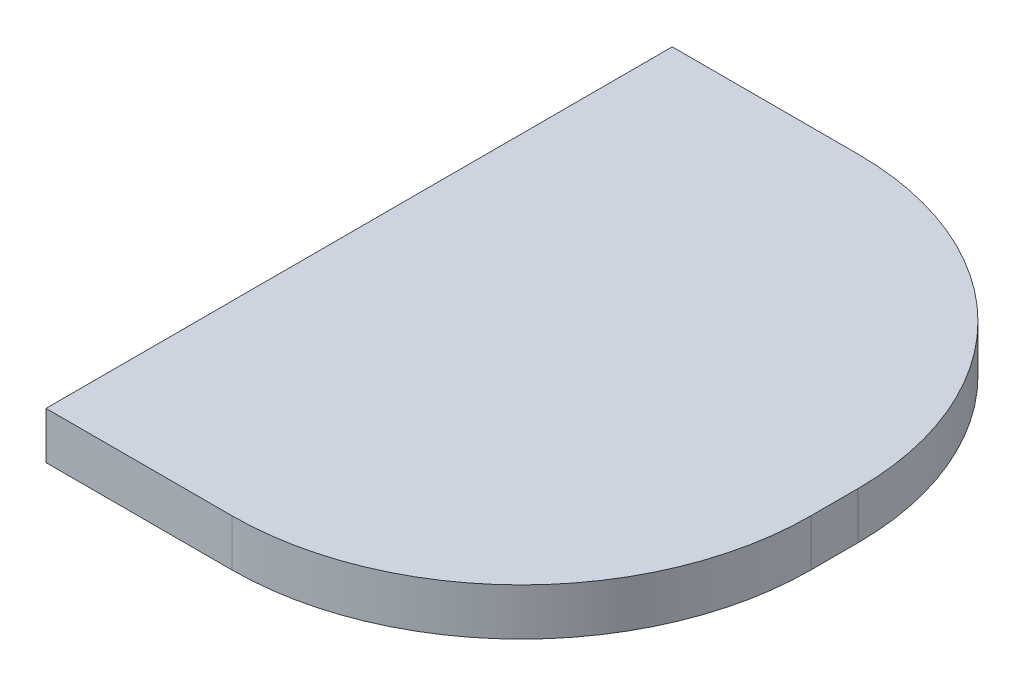
ISO-10303-21;
HEADER;
FILE_DESCRIPTION(('STEP AP214'),'2;1');
FILE_NAME('part.step','',(''),(''),'','','');
FILE_SCHEMA(('AUTOMOTIVE_DESIGN { 1 0 10303 214 1 1 1 1 }'));
ENDSEC;
DATA;
#1=APPLICATION_CONTEXT('core data for automotive mechanical design processes');
#2=APPLICATION_PROTOCOL_DEFINITION('international standard','automotive_design',2000,#1);
#3=PRODUCT_CONTEXT('',#1,'mechanical');
#4=PRODUCT('Part','Part','',(#3));
#5=PRODUCT_RELATED_PRODUCT_CATEGORY('part','',(#4));
#6=PRODUCT_DEFINITION_FORMATION('','',#4);
#7=PRODUCT_DEFINITION_CONTEXT('part definition',#1,'design');
#8=PRODUCT_DEFINITION('design','',#6,#7);
#9=PRODUCT_DEFINITION_SHAPE('','',#8);
#10=(LENGTH_UNIT() NAMED_UNIT(*) SI_UNIT(.MILLI.,.METRE.));
#11=(NAMED_UNIT(*) PLANE_ANGLE_UNIT() SI_UNIT($,.RADIAN.));
#12=(NAMED_UNIT(*) SI_UNIT($,.STERADIAN.) SOLID_ANGLE_UNIT());
#13=UNCERTAINTY_MEASURE_WITH_UNIT(LENGTH_MEASURE(1.E-05),#10,'distance_accuracy_value','');
#14=(GEOMETRIC_REPRESENTATION_CONTEXT(3) GLOBAL_UNCERTAINTY_ASSIGNED_CONTEXT((#13)) GLOBAL_UNIT_ASSIGNED_CONTEXT((#10,
#11,#12)) REPRESENTATION_CONTEXT('',''));
#15=CARTESIAN_POINT('',(0.,0.,0.));
#16=DIRECTION('',(0.,0.,1.));
#17=DIRECTION('',(1.,0.,0.));
#18=AXIS2_PLACEMENT_3D('',#15,#16,#17);
#19=CARTESIAN_POINT('',(15.1833043012193,-1.5,40.));
#20=DIRECTION('',(-1.,0.,0.));
#21=DIRECTION('',(0.,0.,1.));
#22=AXIS2_PLACEMENT_3D('',#19,#20,#21);
#23=PLANE('',#22);
#24=DIRECTION('',(0.,0.,-1.));
#25=VECTOR('',#24,1.);
#26=CARTESIAN_POINT('',(15.1833043012193,1.5,40.));
#27=LINE('',#26,#25);
#28=CARTESIAN_POINT('',(15.1833043012193,1.5,21.5));
#29=VERTEX_POINT('',#28);
#30=CARTESIAN_POINT('',(15.1833043012193,1.5,18.5));
#31=VERTEX_POINT('',#30);
#32=EDGE_CURVE('E110',#29,#31,#27,.T.);
#33=ORIENTED_EDGE('',*,*,#32,.F.);
#34=DIRECTION('',(0.,1.,0.));
#35=VECTOR('',#34,1.);
#36=CARTESIAN_POINT('',(15.1833043012193,-1.5,21.5));
#37=LINE('',#36,#35);
#38=CARTESIAN_POINT('',(15.1833043012193,-1.5,21.5));
#39=VERTEX_POINT('',#38);
#40=EDGE_CURVE('E137',#29,#39,#37,.F.);
#41=ORIENTED_EDGE('',*,*,#40,.T.);
#42=DIRECTION('',(0.,0.,-1.));
#43=VECTOR('',#42,1.);
#44=CARTESIAN_POINT('',(15.1833043012193,-1.5,40.));
#45=LINE('',#44,#43);
#46=CARTESIAN_POINT('',(15.1833043012193,-1.5,18.5));
#47=VERTEX_POINT('',#46);
#48=EDGE_CURVE('E118',#39,#47,#45,.T.);
#49=ORIENTED_EDGE('',*,*,#48,.T.);
#50=DIRECTION('',(0.,1.,0.));
#51=VECTOR('',#50,1.);
#52=CARTESIAN_POINT('',(15.1833043012193,1.5,18.5));
#53=LINE('',#52,#51);
#54=EDGE_CURVE('E134',#47,#31,#53,.T.);
#55=ORIENTED_EDGE('',*,*,#54,.T.);
#56=EDGE_LOOP('',(#33,#41,#49,#55));
#57=FACE_BOUND('',#56,.T.);
#58=ADVANCED_FACE('F38',(#57),#23,.F.);
#59=CARTESIAN_POINT('',(-15.1833043012193,1.5,40.));
#60=DIRECTION('',(0.,-1.,0.));
#61=DIRECTION('',(0.,0.,-1.));
#62=AXIS2_PLACEMENT_3D('',#59,#60,#61);
#63=PLANE('',#62);
#64=DIRECTION('',(-1.,0.,0.));
#65=VECTOR('',#64,1.);
#66=CARTESIAN_POINT('',(-15.1833043012193,1.5,40.));
#67=LINE('',#66,#65);
#68=CARTESIAN_POINT('',(-3.31669569878067,1.5,40.));
#69=VERTEX_POINT('',#68);
#70=CARTESIAN_POINT('',(-15.1833043012193,1.5,40.));
#71=VERTEX_POINT('',#70);
#72=EDGE_CURVE('E92',#69,#71,#67,.T.);
#73=ORIENTED_EDGE('',*,*,#72,.F.);
#74=CARTESIAN_POINT('',(-3.31669569878067,1.5,21.5));
#75=DIRECTION('',(0.,-1.,0.));
#76=DIRECTION('',(0.,0.,-1.));
#77=AXIS2_PLACEMENT_3D('',#74,#75,#76);
#78=CIRCLE('',#77,18.5);
#79=EDGE_CURVE('E132',#69,#29,#78,.F.);
#80=ORIENTED_EDGE('',*,*,#79,.T.);
#81=ORIENTED_EDGE('',*,*,#32,.T.);
#82=CARTESIAN_POINT('',(-3.31669569878067,1.5,18.5));
#83=DIRECTION('',(0.,-1.,0.));
#84=DIRECTION('',(0.,0.,-1.));
#85=AXIS2_PLACEMENT_3D('',#82,#83,#84);
#86=CIRCLE('',#85,18.5);
#87=CARTESIAN_POINT('',(-3.31669569878067,1.5,0.));
#88=VERTEX_POINT('',#87);
#89=EDGE_CURVE('E130',#31,#88,#86,.F.);
#90=ORIENTED_EDGE('',*,*,#89,.T.);
#91=DIRECTION('',(-1.,0.,0.));
#92=VECTOR('',#91,1.);
#93=CARTESIAN_POINT('',(-15.1833043012193,1.5,0.));
#94=LINE('',#93,#92);
#95=CARTESIAN_POINT('',(-15.1833043012193,1.5,0.));
#96=VERTEX_POINT('',#95);
#97=EDGE_CURVE('E107',#88,#96,#94,.T.);
#98=ORIENTED_EDGE('',*,*,#97,.T.);
#99=DIRECTION('',(0.,0.,-1.));
#100=VECTOR('',#99,1.);
#101=CARTESIAN_POINT('',(-15.1833043012193,1.5,40.));
#102=LINE('',#101,#100);
#103=EDGE_CURVE('E105',#71,#96,#102,.T.);
#104=ORIENTED_EDGE('',*,*,#103,.F.);
#105=EDGE_LOOP('',(#73,#80,#81,#90,#98,#104));
#106=FACE_BOUND('',#105,.T.);
#107=ADVANCED_FACE('F106',(#106),#63,.F.);
#108=CARTESIAN_POINT('',(-15.1833043012193,-1.5,40.));
#109=DIRECTION('',(1.,0.,0.));
#110=DIRECTION('',(0.,0.,-1.));
#111=AXIS2_PLACEMENT_3D('',#108,#109,#110);
#112=PLANE('',#111);
#113=DIRECTION('',(0.,-1.,0.));
#114=VECTOR('',#113,1.);
#115=CARTESIAN_POINT('',(-15.1833043012193,-1.5,0.));
#116=LINE('',#115,#114);
#117=CARTESIAN_POINT('',(-15.1833043012193,-1.5,0.));
#118=VERTEX_POINT('',#117);
#119=EDGE_CURVE('E122',#96,#118,#116,.T.);
#120=ORIENTED_EDGE('',*,*,#119,.T.);
#121=DIRECTION('',(0.,0.,-1.));
#122=VECTOR('',#121,1.);
#123=CARTESIAN_POINT('',(-15.1833043012193,-1.5,40.));
#124=LINE('',#123,#122);
#125=CARTESIAN_POINT('',(-15.1833043012193,-1.5,40.));
#126=VERTEX_POINT('',#125);
#127=EDGE_CURVE('E111',#126,#118,#124,.T.);
#128=ORIENTED_EDGE('',*,*,#127,.F.);
#129=DIRECTION('',(0.,-1.,0.));
#130=VECTOR('',#129,1.);
#131=CARTESIAN_POINT('',(-15.1833043012193,-1.5,40.));
#132=LINE('',#131,#130);
#133=EDGE_CURVE('E97',#71,#126,#132,.T.);
#134=ORIENTED_EDGE('',*,*,#133,.F.);
#135=ORIENTED_EDGE('',*,*,#103,.T.);
#136=EDGE_LOOP('',(#120,#128,#134,#135));
#137=FACE_BOUND('',#136,.T.);
#138=ADVANCED_FACE('F113',(#137),#112,.F.);
#139=CARTESIAN_POINT('',(-15.1833043012193,-1.5,40.));
#140=DIRECTION('',(0.,1.,0.));
#141=DIRECTION('',(0.,0.,1.));
#142=AXIS2_PLACEMENT_3D('',#139,#140,#141);
#143=PLANE('',#142);
#144=ORIENTED_EDGE('',*,*,#48,.F.);
#145=CARTESIAN_POINT('',(-3.31669569878067,-1.5,21.5));
#146=DIRECTION('',(0.,1.,0.));
#147=DIRECTION('',(0.,0.,1.));
#148=AXIS2_PLACEMENT_3D('',#145,#146,#147);
#149=CIRCLE('',#148,18.5);
#150=CARTESIAN_POINT('',(-3.31669569878067,-1.5,40.));
#151=VERTEX_POINT('',#150);
#152=EDGE_CURVE('E46',#39,#151,#149,.F.);
#153=ORIENTED_EDGE('',*,*,#152,.T.);
#154=DIRECTION('',(1.,0.,0.));
#155=VECTOR('',#154,1.);
#156=CARTESIAN_POINT('',(-15.1833043012193,-1.5,40.));
#157=LINE('',#156,#155);
#158=EDGE_CURVE('E116',#126,#151,#157,.T.);
#159=ORIENTED_EDGE('',*,*,#158,.F.);
#160=ORIENTED_EDGE('',*,*,#127,.T.);
#161=DIRECTION('',(1.,0.,0.));
#162=VECTOR('',#161,1.);
#163=CARTESIAN_POINT('',(-15.1833043012193,-1.5,0.));
#164=LINE('',#163,#162);
#165=CARTESIAN_POINT('',(-3.31669569878067,-1.5,0.));
#166=VERTEX_POINT('',#165);
#167=EDGE_CURVE('E102',#118,#166,#164,.T.);
#168=ORIENTED_EDGE('',*,*,#167,.T.);
#169=CARTESIAN_POINT('',(-3.31669569878067,-1.5,18.5));
#170=DIRECTION('',(0.,1.,0.));
#171=DIRECTION('',(0.,0.,1.));
#172=AXIS2_PLACEMENT_3D('',#169,#170,#171);
#173=CIRCLE('',#172,18.5);
#174=EDGE_CURVE('E58',#166,#47,#173,.F.);
#175=ORIENTED_EDGE('',*,*,#174,.T.);
#176=EDGE_LOOP('',(#144,#153,#159,#160,#168,#175));
#177=FACE_BOUND('',#176,.T.);
#178=ADVANCED_FACE('F140',(#177),#143,.F.);
#179=CARTESIAN_POINT('',(0.,0.,40.));
#180=DIRECTION('',(0.,0.,-1.));
#181=DIRECTION('',(-1.,0.,0.));
#182=AXIS2_PLACEMENT_3D('',#179,#180,#181);
#183=PLANE('',#182);
#184=ORIENTED_EDGE('',*,*,#158,.T.);
#185=DIRECTION('',(0.,1.,0.));
#186=VECTOR('',#185,1.);
#187=CARTESIAN_POINT('',(-3.31669569878067,0.,40.));
#188=LINE('',#187,#186);
#189=EDGE_CURVE('E100',#151,#69,#188,.T.);
#190=ORIENTED_EDGE('',*,*,#189,.T.);
#191=ORIENTED_EDGE('',*,*,#72,.T.);
#192=ORIENTED_EDGE('',*,*,#133,.T.);
#193=EDGE_LOOP('',(#184,#190,#191,#192));
#194=FACE_BOUND('',#193,.T.);
#195=ADVANCED_FACE('F95',(#194),#183,.F.);
#196=CARTESIAN_POINT('',(0.,0.,0.));
#197=DIRECTION('',(0.,0.,-1.));
#198=DIRECTION('',(-1.,0.,0.));
#199=AXIS2_PLACEMENT_3D('',#196,#197,#198);
#200=PLANE('',#199);
#201=ORIENTED_EDGE('',*,*,#97,.F.);
#202=DIRECTION('',(0.,1.,0.));
#203=VECTOR('',#202,1.);
#204=CARTESIAN_POINT('',(-3.31669569878067,-1.5,0.));
#205=LINE('',#204,#203);
#206=EDGE_CURVE('E11',#88,#166,#205,.F.);
#207=ORIENTED_EDGE('',*,*,#206,.T.);
#208=ORIENTED_EDGE('',*,*,#167,.F.);
#209=ORIENTED_EDGE('',*,*,#119,.F.);
#210=EDGE_LOOP('',(#201,#207,#208,#209));
#211=FACE_BOUND('',#210,.T.);
#212=ADVANCED_FACE('F148',(#211),#200,.T.);
#213=CARTESIAN_POINT('',(-3.31669569878067,0.,21.5));
#214=DIRECTION('',(0.,1.,0.));
#215=DIRECTION('',(0.,0.,1.));
#216=AXIS2_PLACEMENT_3D('',#213,#214,#215);
#217=CYLINDRICAL_SURFACE('',#216,18.5);
#218=ORIENTED_EDGE('',*,*,#152,.F.);
#219=ORIENTED_EDGE('',*,*,#40,.F.);
#220=ORIENTED_EDGE('',*,*,#79,.F.);
#221=ORIENTED_EDGE('',*,*,#189,.F.);
#222=EDGE_LOOP('',(#218,#219,#220,#221));
#223=FACE_BOUND('',#222,.T.);
#224=ADVANCED_FACE('F143',(#223),#217,.T.);
#225=CARTESIAN_POINT('',(-3.31669569878067,-1.5,18.5));
#226=DIRECTION('',(0.,-1.,0.));
#227=DIRECTION('',(0.,0.,-1.));
#228=AXIS2_PLACEMENT_3D('',#225,#226,#227);
#229=CYLINDRICAL_SURFACE('',#228,18.5);
#230=ORIENTED_EDGE('',*,*,#174,.F.);
#231=ORIENTED_EDGE('',*,*,#206,.F.);
#232=ORIENTED_EDGE('',*,*,#89,.F.);
#233=ORIENTED_EDGE('',*,*,#54,.F.);
#234=EDGE_LOOP('',(#230,#231,#232,#233));
#235=FACE_BOUND('',#234,.T.);
#236=ADVANCED_FACE('F40',(#235),#229,.T.);
#237=CLOSED_SHELL('',(#58,#107,#138,#178,#195,#212,#224,#236));
#238=MANIFOLD_SOLID_BREP('B2',#237);
#239=ADVANCED_BREP_SHAPE_REPRESENTATION('',(#18,#238),#14);
#240=SHAPE_DEFINITION_REPRESENTATION(#9,#239);
ENDSEC;
END-ISO-10303-21;
